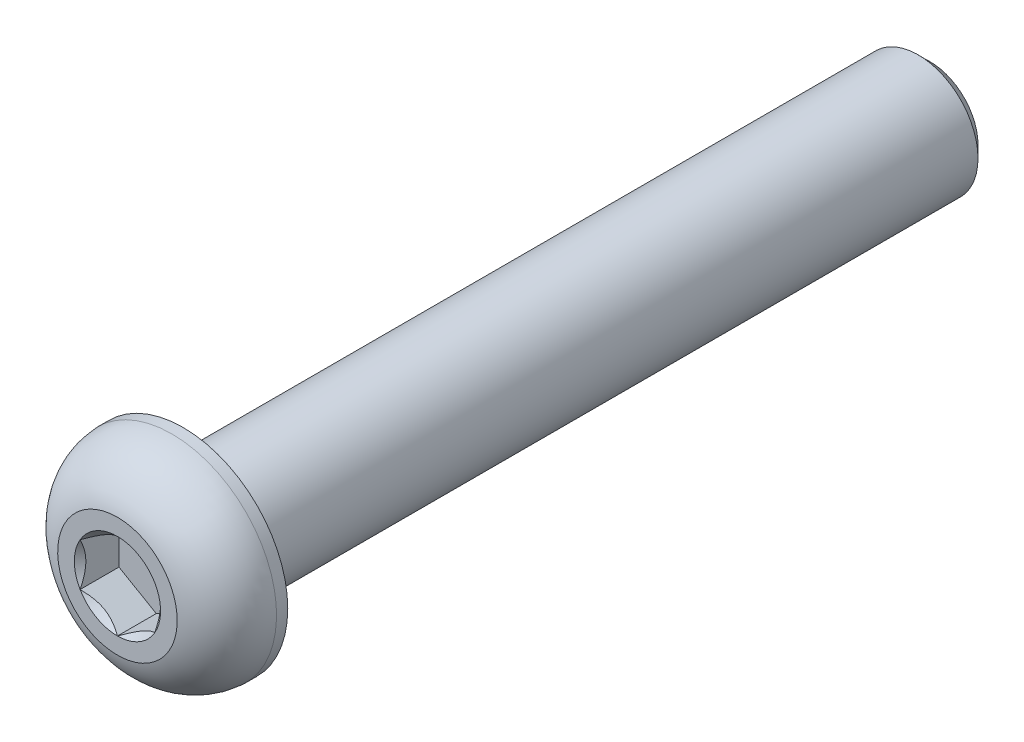
ISO-10303-21;
HEADER;
FILE_DESCRIPTION(('STEP AP214'),'2;1');
FILE_NAME('part.step','',(''),(''),'','','');
FILE_SCHEMA(('AUTOMOTIVE_DESIGN { 1 0 10303 214 1 1 1 1 }'));
ENDSEC;
DATA;
#1=APPLICATION_CONTEXT('core data for automotive mechanical design processes');
#2=APPLICATION_PROTOCOL_DEFINITION('international standard','automotive_design',2000,#1);
#3=PRODUCT_CONTEXT('',#1,'mechanical');
#4=PRODUCT('Part','Part','',(#3));
#5=PRODUCT_RELATED_PRODUCT_CATEGORY('part','',(#4));
#6=PRODUCT_DEFINITION_FORMATION('','',#4);
#7=PRODUCT_DEFINITION_CONTEXT('part definition',#1,'design');
#8=PRODUCT_DEFINITION('design','',#6,#7);
#9=PRODUCT_DEFINITION_SHAPE('','',#8);
#10=(LENGTH_UNIT() NAMED_UNIT(*) SI_UNIT(.MILLI.,.METRE.));
#11=(NAMED_UNIT(*) PLANE_ANGLE_UNIT() SI_UNIT($,.RADIAN.));
#12=(NAMED_UNIT(*) SI_UNIT($,.STERADIAN.) SOLID_ANGLE_UNIT());
#13=UNCERTAINTY_MEASURE_WITH_UNIT(LENGTH_MEASURE(1.E-05),#10,'distance_accuracy_value','');
#14=(GEOMETRIC_REPRESENTATION_CONTEXT(3) GLOBAL_UNCERTAINTY_ASSIGNED_CONTEXT((#13)) GLOBAL_UNIT_ASSIGNED_CONTEXT((#10,
#11,#12)) REPRESENTATION_CONTEXT('',''));
#15=CARTESIAN_POINT('',(0.,0.,0.));
#16=DIRECTION('',(0.,0.,1.));
#17=DIRECTION('',(1.,0.,0.));
#18=AXIS2_PLACEMENT_3D('',#15,#16,#17);
#19=CARTESIAN_POINT('',(-20.,0.,-71.2));
#20=DIRECTION('',(0.,0.,1.));
#21=DIRECTION('',(1.,0.,0.));
#22=AXIS2_PLACEMENT_3D('',#19,#20,#21);
#23=CYLINDRICAL_SURFACE('',#22,4.);
#24=CARTESIAN_POINT('',(-20.,0.,-70.4));
#25=DIRECTION('',(0.,0.,1.));
#26=DIRECTION('',(1.,0.,0.));
#27=AXIS2_PLACEMENT_3D('',#24,#25,#26);
#28=CIRCLE('',#27,4.);
#29=CARTESIAN_POINT('',(-16.,0.,-70.4));
#30=VERTEX_POINT('',#29);
#31=EDGE_CURVE('E50',#30,#30,#28,.T.);
#32=ORIENTED_EDGE('',*,*,#31,.T.);
#33=EDGE_LOOP('',(#32));
#34=FACE_BOUND('',#33,.T.);
#35=CARTESIAN_POINT('',(-20.,0.,-21.2));
#36=DIRECTION('',(0.,0.,1.));
#37=DIRECTION('',(1.,0.,0.));
#38=AXIS2_PLACEMENT_3D('',#35,#36,#37);
#39=CIRCLE('',#38,4.);
#40=CARTESIAN_POINT('',(-16.,0.,-21.2));
#41=VERTEX_POINT('',#40);
#42=EDGE_CURVE('E115',#41,#41,#39,.T.);
#43=ORIENTED_EDGE('',*,*,#42,.F.);
#44=EDGE_LOOP('',(#43));
#45=FACE_BOUND('',#44,.T.);
#46=ADVANCED_FACE('F41',(#34,#45),#23,.T.);
#47=CARTESIAN_POINT('',(-20.,0.,-71.2));
#48=DIRECTION('',(0.,0.,1.));
#49=DIRECTION('',(1.,0.,0.));
#50=AXIS2_PLACEMENT_3D('',#47,#48,#49);
#51=PLANE('',#50);
#52=CARTESIAN_POINT('',(-20.,0.,-71.2));
#53=DIRECTION('',(0.,0.,1.));
#54=DIRECTION('',(1.,0.,0.));
#55=AXIS2_PLACEMENT_3D('',#52,#53,#54);
#56=CIRCLE('',#55,3.19999999999999);
#57=CARTESIAN_POINT('',(-16.8,0.,-71.2));
#58=VERTEX_POINT('',#57);
#59=EDGE_CURVE('E11',#58,#58,#56,.F.);
#60=ORIENTED_EDGE('',*,*,#59,.T.);
#61=EDGE_LOOP('',(#60));
#62=FACE_BOUND('',#61,.T.);
#63=ADVANCED_FACE('F208',(#62),#51,.F.);
#64=CARTESIAN_POINT('',(-20.,0.,-16.8));
#65=DIRECTION('',(0.,0.,-1.));
#66=DIRECTION('',(-1.,0.,0.));
#67=AXIS2_PLACEMENT_3D('',#64,#65,#66);
#68=CYLINDRICAL_SURFACE('',#67,7.);
#69=CARTESIAN_POINT('',(-20.,0.,-21.2));
#70=DIRECTION('',(0.,0.,1.));
#71=DIRECTION('',(1.,0.,0.));
#72=AXIS2_PLACEMENT_3D('',#69,#70,#71);
#73=CIRCLE('',#72,7.);
#74=CARTESIAN_POINT('',(-13.,0.,-21.2));
#75=VERTEX_POINT('',#74);
#76=EDGE_CURVE('E270',#75,#75,#73,.T.);
#77=ORIENTED_EDGE('',*,*,#76,.T.);
#78=EDGE_LOOP('',(#77));
#79=FACE_BOUND('',#78,.T.);
#80=CARTESIAN_POINT('',(-20.,0.,-20.4492371013581));
#81=DIRECTION('',(0.,0.,-1.));
#82=DIRECTION('',(0.,1.,0.));
#83=AXIS2_PLACEMENT_3D('',#80,#81,#82);
#84=CIRCLE('',#83,7.);
#85=CARTESIAN_POINT('',(-20.,6.99999999999999,-20.4492371013581));
#86=VERTEX_POINT('',#85);
#87=EDGE_CURVE('E267',#86,#86,#84,.T.);
#88=ORIENTED_EDGE('',*,*,#87,.T.);
#89=EDGE_LOOP('',(#88));
#90=FACE_BOUND('',#89,.T.);
#91=ADVANCED_FACE('F214',(#79,#90),#68,.T.);
#92=CARTESIAN_POINT('',(-20.,0.,-21.2));
#93=DIRECTION('',(0.,0.,1.));
#94=DIRECTION('',(1.,0.,0.));
#95=AXIS2_PLACEMENT_3D('',#92,#93,#94);
#96=PLANE('',#95);
#97=ORIENTED_EDGE('',*,*,#42,.T.);
#98=EDGE_LOOP('',(#97));
#99=FACE_BOUND('',#98,.T.);
#100=ORIENTED_EDGE('',*,*,#76,.F.);
#101=EDGE_LOOP('',(#100));
#102=FACE_BOUND('',#101,.T.);
#103=ADVANCED_FACE('F222',(#99,#102),#96,.F.);
#104=CARTESIAN_POINT('',(-20.,0.,-20.6746185506791));
#105=DIRECTION('',(0.,0.,-1.));
#106=DIRECTION('',(0.,1.,0.));
#107=AXIS2_PLACEMENT_3D('',#104,#105,#106);
#108=DEGENERATE_TOROIDAL_SURFACE('',#107,3.00635464740521,4.,.T.);
#109=CARTESIAN_POINT('',(-20.,0.,-16.8));
#110=DIRECTION('',(0.,0.,-1.));
#111=DIRECTION('',(0.,1.,0.));
#112=AXIS2_PLACEMENT_3D('',#109,#110,#111);
#113=CIRCLE('',#112,4.);
#114=CARTESIAN_POINT('',(-20.,3.99999999999999,-16.8));
#115=VERTEX_POINT('',#114);
#116=EDGE_CURVE('E256',#115,#115,#113,.T.);
#117=ORIENTED_EDGE('',*,*,#116,.T.);
#118=EDGE_LOOP('',(#117));
#119=FACE_BOUND('',#118,.T.);
#120=ORIENTED_EDGE('',*,*,#87,.F.);
#121=EDGE_LOOP('',(#120));
#122=FACE_BOUND('',#121,.T.);
#123=ADVANCED_FACE('F226',(#119,#122),#108,.T.);
#124=CARTESIAN_POINT('',(-20.,0.,-16.8));
#125=DIRECTION('',(0.,0.,1.));
#126=DIRECTION('',(1.,0.,0.));
#127=AXIS2_PLACEMENT_3D('',#124,#125,#126);
#128=PLANE('',#127);
#129=CARTESIAN_POINT('',(-20.,0.,-16.8));
#130=DIRECTION('',(0.,0.,1.));
#131=DIRECTION('',(1.,0.,0.));
#132=AXIS2_PLACEMENT_3D('',#129,#130,#131);
#133=CIRCLE('',#132,2.88675134594814);
#134=CARTESIAN_POINT('',(-17.5,1.44337567297408,-16.8));
#135=VERTEX_POINT('',#134);
#136=CARTESIAN_POINT('',(-20.,2.88675134594814,-16.8));
#137=VERTEX_POINT('',#136);
#138=EDGE_CURVE('E96',#135,#137,#133,.T.);
#139=ORIENTED_EDGE('',*,*,#138,.F.);
#140=CARTESIAN_POINT('',(-17.5,-1.44337567297407,-16.8));
#141=VERTEX_POINT('',#140);
#142=EDGE_CURVE('E56',#141,#135,#133,.T.);
#143=ORIENTED_EDGE('',*,*,#142,.F.);
#144=CARTESIAN_POINT('',(-20.,-2.88675134594814,-16.8));
#145=VERTEX_POINT('',#144);
#146=EDGE_CURVE('E288',#145,#141,#133,.T.);
#147=ORIENTED_EDGE('',*,*,#146,.F.);
#148=CARTESIAN_POINT('',(-22.5,-1.44337567297408,-16.8));
#149=VERTEX_POINT('',#148);
#150=EDGE_CURVE('E63',#149,#145,#133,.T.);
#151=ORIENTED_EDGE('',*,*,#150,.F.);
#152=CARTESIAN_POINT('',(-22.5,1.44337567297406,-16.8));
#153=VERTEX_POINT('',#152);
#154=EDGE_CURVE('E137',#153,#149,#133,.T.);
#155=ORIENTED_EDGE('',*,*,#154,.F.);
#156=EDGE_CURVE('E105',#137,#153,#133,.T.);
#157=ORIENTED_EDGE('',*,*,#156,.F.);
#158=EDGE_LOOP('',(#139,#143,#147,#151,#155,#157));
#159=FACE_BOUND('',#158,.T.);
#160=ORIENTED_EDGE('',*,*,#116,.F.);
#161=EDGE_LOOP('',(#160));
#162=FACE_BOUND('',#161,.T.);
#163=ADVANCED_FACE('F135',(#159,#162),#128,.T.);
#164=CARTESIAN_POINT('',(-20.,0.,-16.8));
#165=DIRECTION('',(0.,0.,1.));
#166=DIRECTION('',(1.,0.,0.));
#167=AXIS2_PLACEMENT_3D('',#164,#165,#166);
#168=CONICAL_SURFACE('',#167,2.88675134594814,0.78539816339745);
#169=ORIENTED_EDGE('',*,*,#156,.T.);
#170=CARTESIAN_POINT('',(-19.9998,2.88686681600196,-16.7998845230182));
#171=CARTESIAN_POINT('',(-20.0857382777878,2.8372503281875,-16.8494592946453));
#172=CARTESIAN_POINT('',(-20.1731135672758,2.78680418128109,-16.8961225186375));
#173=CARTESIAN_POINT('',(-20.3512814561656,2.6839389026696,-16.9815618599617));
#174=CARTESIAN_POINT('',(-20.4420910006811,2.6315099876986,-17.020290437594));
#175=CARTESIAN_POINT('',(-20.6252041231269,2.52578957716234,-17.0866332961023));
#176=CARTESIAN_POINT('',(-20.7174610645293,2.47252500720904,-17.1144143314691));
#177=CARTESIAN_POINT('',(-20.9040060087763,2.3648232334321,-17.1572168240893));
#178=CARTESIAN_POINT('',(-20.9982883125663,2.31038931995913,-17.1722702333287));
#179=CARTESIAN_POINT('',(-21.1607782582918,2.21657570605387,-17.1858522777905));
#180=CARTESIAN_POINT('',(-21.2287759678801,2.17731721011878,-17.1878629007592));
#181=CARTESIAN_POINT('',(-21.3646602411692,2.0988643883567,-17.1844758828125));
#182=CARTESIAN_POINT('',(-21.4325467575522,2.05967008984862,-17.1790756447002));
#183=CARTESIAN_POINT('',(-21.5676787882361,1.98165157555715,-17.1611742115975));
#184=CARTESIAN_POINT('',(-21.6349234997536,1.94282782326097,-17.1486650729535));
#185=CARTESIAN_POINT('',(-21.7682501008182,1.86585167424616,-17.1172324980443));
#186=CARTESIAN_POINT('',(-21.8343320790997,1.82769922629678,-17.0983095535032));
#187=CARTESIAN_POINT('',(-22.0035963466913,1.72997445583858,-17.0421326385918));
#188=CARTESIAN_POINT('',(-22.1057291222229,1.67100807039231,-17.0006441684038));
#189=CARTESIAN_POINT('',(-22.2559064149405,1.58430317001562,-16.9306059532769));
#190=CARTESIAN_POINT('',(-22.3053965398826,1.55573003305807,-16.9059977478839));
#191=CARTESIAN_POINT('',(-22.4034600638388,1.49911303110426,-16.8545381132848));
#192=CARTESIAN_POINT('',(-22.4520340034969,1.47106885396706,-16.8276880612207));
#193=CARTESIAN_POINT('',(-22.5002,1.44326020292023,-16.7998845230182));
#194=B_SPLINE_CURVE_WITH_KNOTS('',3,(#170,#171,#172,#173,#174,#175,#176,#177,#178,#179,#180,
#181,#182,#183,#184,#185,#186,#187,#188,#189,#190,#191,#192,#193),.UNSPECIFIED.,.F.,.F.,(4,2,2,
2,2,2,2,2,2,2,2,4),(0.,0.333012085133922,0.667964518301391,0.997597032043288,1.32639954393843,
1.56169424147168,1.79707142102082,2.0327121352217,2.26833478775649,2.64260240809532,
2.82922877818863,3.01574133749024),.UNSPECIFIED.);
#195=EDGE_CURVE('E110',#137,#153,#194,.T.);
#196=ORIENTED_EDGE('',*,*,#195,.F.);
#197=EDGE_LOOP('',(#169,#196));
#198=FACE_BOUND('',#197,.T.);
#199=ADVANCED_FACE('F111',(#198),#168,.F.);
#200=ORIENTED_EDGE('',*,*,#154,.T.);
#201=CARTESIAN_POINT('',(-22.5,4.49862613627795,-14.5401372051753));
#202=CARTESIAN_POINT('',(-22.5,4.36631721471857,-14.6557441977496));
#203=CARTESIAN_POINT('',(-22.5,4.2334468206294,-14.7707212796145));
#204=CARTESIAN_POINT('',(-22.5,3.96614359075441,-14.998965357782));
#205=CARTESIAN_POINT('',(-22.5,3.83171007828055,-15.1122315606403));
#206=CARTESIAN_POINT('',(-22.5,3.55815834420279,-15.3388189124461));
#207=CARTESIAN_POINT('',(-22.5,3.41900074596122,-15.4520926999651));
#208=CARTESIAN_POINT('',(-22.5,3.13816540864501,-15.6754153293813));
#209=CARTESIAN_POINT('',(-22.5,2.99648829813198,-15.7854649579876));
#210=CARTESIAN_POINT('',(-22.5,2.70961149424399,-16.0012350616157));
#211=CARTESIAN_POINT('',(-22.5,2.56440811475055,-16.1069506660195));
#212=CARTESIAN_POINT('',(-22.5,2.26935886391242,-16.3120352810879));
#213=CARTESIAN_POINT('',(-22.5,2.1195094173423,-16.4113992145075));
#214=CARTESIAN_POINT('',(-22.5,1.81473474990813,-16.5998493815048));
#215=CARTESIAN_POINT('',(-22.5,1.65984817680388,-16.6889973545657));
#216=CARTESIAN_POINT('',(-22.5,1.34241016747155,-16.8523912225315));
#217=CARTESIAN_POINT('',(-22.5,1.17987279751072,-16.9266632400684));
#218=CARTESIAN_POINT('',(-22.5,0.927579236460874,-17.0213841826896));
#219=CARTESIAN_POINT('',(-22.5,0.841058688340694,-17.0504014253439));
#220=CARTESIAN_POINT('',(-22.5,0.665833262959965,-17.1009634522494));
#221=CARTESIAN_POINT('',(-22.5,0.577128732612051,-17.1225094151718));
#222=CARTESIAN_POINT('',(-22.5,0.39864435461647,-17.1566697169734));
#223=CARTESIAN_POINT('',(-22.5,0.308876821359169,-17.1693471500471));
#224=CARTESIAN_POINT('',(-22.5,0.128495601940259,-17.1850625327669));
#225=CARTESIAN_POINT('',(-22.5,0.0378820484480431,-17.1881019691611));
#226=CARTESIAN_POINT('',(-22.5,-0.143434587916144,-17.1842867231653));
#227=CARTESIAN_POINT('',(-22.5,-0.234136958906022,-17.1773989593265));
#228=CARTESIAN_POINT('',(-22.5,-0.414325653644167,-17.1542287088775));
#229=CARTESIAN_POINT('',(-22.5,-0.503811705770317,-17.137944157992));
#230=CARTESIAN_POINT('',(-22.5,-0.681540531837641,-17.0969731933558));
#231=CARTESIAN_POINT('',(-22.5,-0.769768082838922,-17.0722219859227));
#232=CARTESIAN_POINT('',(-22.5,-0.943931821370619,-17.0157563839652));
#233=CARTESIAN_POINT('',(-22.5,-1.02986790429993,-16.9840416721783));
#234=CARTESIAN_POINT('',(-22.5,-1.21442871168212,-16.908888337474));
#235=CARTESIAN_POINT('',(-22.5,-1.31260872704221,-16.8643682202414));
#236=CARTESIAN_POINT('',(-22.5,-1.50606624427993,-16.7693671776859));
#237=CARTESIAN_POINT('',(-22.5,-1.60134208055272,-16.7188829098143));
#238=CARTESIAN_POINT('',(-22.5,-1.78951407974901,-16.6132701412246));
#239=CARTESIAN_POINT('',(-22.5,-1.88240508306521,-16.5581325231622));
#240=CARTESIAN_POINT('',(-22.5,-2.06598114426054,-16.4443613162886));
#241=CARTESIAN_POINT('',(-22.5,-2.15666662219708,-16.3857284006394));
#242=CARTESIAN_POINT('',(-22.5,-2.33669825134608,-16.2653991342853));
#243=CARTESIAN_POINT('',(-22.5,-2.42603424932677,-16.2036876631612));
#244=CARTESIAN_POINT('',(-22.5,-2.60315746105273,-16.0780755199221));
#245=CARTESIAN_POINT('',(-22.5,-2.69094455711592,-16.0141746825398));
#246=CARTESIAN_POINT('',(-22.5,-2.95215706334526,-15.8200214272822));
#247=CARTESIAN_POINT('',(-22.5,-3.12364882600439,-15.6871712948484));
#248=CARTESIAN_POINT('',(-22.5,-3.49980821722714,-15.387554664258));
#249=CARTESIAN_POINT('',(-22.5,-3.70359202428011,-15.2196884747092));
#250=CARTESIAN_POINT('',(-22.5,-4.00519395775443,-14.9656562548721));
#251=CARTESIAN_POINT('',(-22.5,-4.10442571709459,-14.881155245238));
#252=CARTESIAN_POINT('',(-22.5,-4.30208719506624,-14.711270852601));
#253=CARTESIAN_POINT('',(-22.5,-4.40051711297303,-14.6258877015855));
#254=CARTESIAN_POINT('',(-22.5,-4.49862613627795,-14.5401372051753));
#255=B_SPLINE_CURVE_WITH_KNOTS('',3,(#201,#202,#203,#204,#205,#206,#207,#208,#209,#210,#211,
#212,#213,#214,#215,#216,#217,#218,#219,#220,#221,#222,#223,#224,#225,#226,#227,#228,#229,#230,
#231,#232,#233,#234,#235,#236,#237,#238,#239,#240,#241,#242,#243,#244,#245,#246,#247,#248,#249,
#250,#251,#252,#253,#254),.UNSPECIFIED.,.F.,.F.,(4,2,2,2,2,2,2,2,2,2,2,2,2,2,2,2,2,2,2,2,2,2,2,
2,2,2,4),(0.,0.527111663405214,1.05446070809944,1.59272193747455,2.13085071597393,
2.66956853854308,3.20871173802189,3.74440249620264,4.27914415459521,4.55264840930147,
4.82610949624842,5.09760472594187,5.36905807300277,5.64141810669612,5.91383799491442,
6.18839111423807,6.4629567450015,6.78609426817658,7.10941375743029,7.4333821286659,
7.75728830689595,8.08298202171529,8.40870037636492,9.05935611118931,9.8513240612482,
10.242327211952,10.6332300284246),.UNSPECIFIED.);
#256=EDGE_CURVE('E104',#153,#149,#255,.T.);
#257=ORIENTED_EDGE('',*,*,#256,.F.);
#258=EDGE_LOOP('',(#200,#257));
#259=FACE_BOUND('',#258,.T.);
#260=ADVANCED_FACE('F296',(#259),#168,.F.);
#261=ORIENTED_EDGE('',*,*,#150,.T.);
#262=CARTESIAN_POINT('',(-22.5002,-1.44326020292022,-16.7998845230182));
#263=CARTESIAN_POINT('',(-22.4142617222122,-1.49287669073468,-16.8494592946453));
#264=CARTESIAN_POINT('',(-22.3268864327242,-1.54332283764109,-16.8961225186375));
#265=CARTESIAN_POINT('',(-22.1487185438344,-1.64618811625259,-16.9815618599617));
#266=CARTESIAN_POINT('',(-22.0579089993189,-1.69861703122359,-17.020290437594));
#267=CARTESIAN_POINT('',(-21.8747958768731,-1.80433744175985,-17.0866332961023));
#268=CARTESIAN_POINT('',(-21.7825389354707,-1.85760201171315,-17.1144143314692));
#269=CARTESIAN_POINT('',(-21.5959939912237,-1.96530378549009,-17.1572168240893));
#270=CARTESIAN_POINT('',(-21.5017116874337,-2.01973769896306,-17.1722702333287));
#271=CARTESIAN_POINT('',(-21.3392217417082,-2.11355131286832,-17.1858522777905));
#272=CARTESIAN_POINT('',(-21.2712240321198,-2.15280980880341,-17.1878629007592));
#273=CARTESIAN_POINT('',(-21.1353397588308,-2.23126263056549,-17.1844758828125));
#274=CARTESIAN_POINT('',(-21.0674532424478,-2.27045692907357,-17.1790756447002));
#275=CARTESIAN_POINT('',(-20.9323212117639,-2.34847544336504,-17.1611742115975));
#276=CARTESIAN_POINT('',(-20.8650765002464,-2.38729919566122,-17.1486650729535));
#277=CARTESIAN_POINT('',(-20.7317498991818,-2.46427534467603,-17.1172324980443));
#278=CARTESIAN_POINT('',(-20.6656679209003,-2.50242779262541,-17.0983095535032));
#279=CARTESIAN_POINT('',(-20.4964036533087,-2.60015256308361,-17.0421326385918));
#280=CARTESIAN_POINT('',(-20.3942708777771,-2.65911894852988,-17.0006441684038));
#281=CARTESIAN_POINT('',(-20.2440935850595,-2.74582384890657,-16.9306059532769));
#282=CARTESIAN_POINT('',(-20.1946034601174,-2.77439698586412,-16.9059977478839));
#283=CARTESIAN_POINT('',(-20.0965399361612,-2.83101398781793,-16.8545381132848));
#284=CARTESIAN_POINT('',(-20.0479659965031,-2.85905816495513,-16.8276880612207));
#285=CARTESIAN_POINT('',(-19.9998,-2.88686681600196,-16.7998845230182));
#286=B_SPLINE_CURVE_WITH_KNOTS('',3,(#262,#263,#264,#265,#266,#267,#268,#269,#270,#271,#272,
#273,#274,#275,#276,#277,#278,#279,#280,#281,#282,#283,#284,#285),.UNSPECIFIED.,.F.,.F.,(4,2,2,
2,2,2,2,2,2,2,2,4),(0.,0.333012085133922,0.667964518301396,0.997597032043301,1.32639954393844,
1.56169424147169,1.79707142102083,2.03271213522171,2.26833478775651,2.64260240809533,
2.82922877818864,3.01574133749025),.UNSPECIFIED.);
#287=EDGE_CURVE('E147',#149,#145,#286,.T.);
#288=ORIENTED_EDGE('',*,*,#287,.F.);
#289=EDGE_LOOP('',(#261,#288));
#290=FACE_BOUND('',#289,.T.);
#291=ADVANCED_FACE('F291',(#290),#168,.F.);
#292=ORIENTED_EDGE('',*,*,#146,.T.);
#293=CARTESIAN_POINT('',(-20.0002,-2.88686681600196,-16.7998845230182));
#294=CARTESIAN_POINT('',(-19.9142617222122,-2.83725032818751,-16.8494592946453));
#295=CARTESIAN_POINT('',(-19.8268864327242,-2.7868041812811,-16.8961225186375));
#296=CARTESIAN_POINT('',(-19.6487185438344,-2.6839389026696,-16.9815618599617));
#297=CARTESIAN_POINT('',(-19.5579089993189,-2.6315099876986,-17.020290437594));
#298=CARTESIAN_POINT('',(-19.3747958768731,-2.52578957716234,-17.0866332961023));
#299=CARTESIAN_POINT('',(-19.2825389354707,-2.47252500720904,-17.1144143314691));
#300=CARTESIAN_POINT('',(-19.0959939912237,-2.36482323343211,-17.1572168240893));
#301=CARTESIAN_POINT('',(-19.0017116874337,-2.31038931995913,-17.1722702333287));
#302=CARTESIAN_POINT('',(-18.8392217417082,-2.21657570605387,-17.1858522777905));
#303=CARTESIAN_POINT('',(-18.7712240321199,-2.17731721011879,-17.1878629007592));
#304=CARTESIAN_POINT('',(-18.6353397588308,-2.09886438835671,-17.1844758828125));
#305=CARTESIAN_POINT('',(-18.5674532424478,-2.05967008984862,-17.1790756447002));
#306=CARTESIAN_POINT('',(-18.4323212117639,-1.98165157555715,-17.1611742115975));
#307=CARTESIAN_POINT('',(-18.3650765002464,-1.94282782326097,-17.1486650729535));
#308=CARTESIAN_POINT('',(-18.2317498991818,-1.86585167424616,-17.1172324980443));
#309=CARTESIAN_POINT('',(-18.1656679209003,-1.82769922629678,-17.0983095535032));
#310=CARTESIAN_POINT('',(-17.9964036533087,-1.72997445583858,-17.0421326385918));
#311=CARTESIAN_POINT('',(-17.8942708777771,-1.67100807039231,-17.0006441684038));
#312=CARTESIAN_POINT('',(-17.7440935850595,-1.58430317001563,-16.9306059532769));
#313=CARTESIAN_POINT('',(-17.6946034601174,-1.55573003305808,-16.9059977478839));
#314=CARTESIAN_POINT('',(-17.5965399361612,-1.49911303110426,-16.8545381132848));
#315=CARTESIAN_POINT('',(-17.5479659965031,-1.47106885396707,-16.8276880612207));
#316=CARTESIAN_POINT('',(-17.4998,-1.44326020292023,-16.7998845230182));
#317=B_SPLINE_CURVE_WITH_KNOTS('',3,(#293,#294,#295,#296,#297,#298,#299,#300,#301,#302,#303,
#304,#305,#306,#307,#308,#309,#310,#311,#312,#313,#314,#315,#316),.UNSPECIFIED.,.F.,.F.,(4,2,2,
2,2,2,2,2,2,2,2,4),(0.,0.333012085133917,0.667964518301387,0.997597032043288,1.32639954393843,
1.56169424147167,1.79707142102081,2.03271213522169,2.26833478775649,2.64260240809531,
2.82922877818862,3.01574133749023),.UNSPECIFIED.);
#318=EDGE_CURVE('E173',#145,#141,#317,.T.);
#319=ORIENTED_EDGE('',*,*,#318,.F.);
#320=EDGE_LOOP('',(#292,#319));
#321=FACE_BOUND('',#320,.T.);
#322=ADVANCED_FACE('F289',(#321),#168,.F.);
#323=ORIENTED_EDGE('',*,*,#142,.T.);
#324=CARTESIAN_POINT('',(-17.5,-4.49862613627796,-14.5401372051753));
#325=CARTESIAN_POINT('',(-17.5,-4.36631721471859,-14.6557441977496));
#326=CARTESIAN_POINT('',(-17.5,-4.23344682062941,-14.7707212796145));
#327=CARTESIAN_POINT('',(-17.5,-3.96614359075442,-14.998965357782));
#328=CARTESIAN_POINT('',(-17.5,-3.83171007828056,-15.1122315606403));
#329=CARTESIAN_POINT('',(-17.5,-3.5581583442028,-15.3388189124461));
#330=CARTESIAN_POINT('',(-17.5,-3.41900074596123,-15.4520926999651));
#331=CARTESIAN_POINT('',(-17.5,-3.13816540864502,-15.6754153293813));
#332=CARTESIAN_POINT('',(-17.5,-2.99648829813199,-15.7854649579876));
#333=CARTESIAN_POINT('',(-17.5,-2.709611494244,-16.0012350616157));
#334=CARTESIAN_POINT('',(-17.5,-2.56440811475056,-16.1069506660195));
#335=CARTESIAN_POINT('',(-17.5,-2.26935886391243,-16.3120352810879));
#336=CARTESIAN_POINT('',(-17.5,-2.1195094173423,-16.4113992145075));
#337=CARTESIAN_POINT('',(-17.5,-1.81473474990813,-16.5998493815048));
#338=CARTESIAN_POINT('',(-17.5,-1.65984817680388,-16.6889973545657));
#339=CARTESIAN_POINT('',(-17.5,-1.34241016747155,-16.8523912225315));
#340=CARTESIAN_POINT('',(-17.5,-1.17987279751072,-16.9266632400684));
#341=CARTESIAN_POINT('',(-17.5,-0.927579236460876,-17.0213841826896));
#342=CARTESIAN_POINT('',(-17.5,-0.841058688340696,-17.0504014253439));
#343=CARTESIAN_POINT('',(-17.5,-0.665833262959967,-17.1009634522494));
#344=CARTESIAN_POINT('',(-17.5,-0.577128732612053,-17.1225094151718));
#345=CARTESIAN_POINT('',(-17.5,-0.398644354616472,-17.1566697169734));
#346=CARTESIAN_POINT('',(-17.5,-0.30887682135917,-17.1693471500471));
#347=CARTESIAN_POINT('',(-17.5,-0.12849560194026,-17.1850625327669));
#348=CARTESIAN_POINT('',(-17.5,-0.0378820484480437,-17.1881019691611));
#349=CARTESIAN_POINT('',(-17.5,0.143434587916143,-17.1842867231653));
#350=CARTESIAN_POINT('',(-17.5,0.234136958906022,-17.1773989593265));
#351=CARTESIAN_POINT('',(-17.5,0.414325653644168,-17.1542287088775));
#352=CARTESIAN_POINT('',(-17.5,0.503811705770318,-17.137944157992));
#353=CARTESIAN_POINT('',(-17.5,0.681540531837642,-17.0969731933558));
#354=CARTESIAN_POINT('',(-17.5,0.769768082838922,-17.0722219859227));
#355=CARTESIAN_POINT('',(-17.5,0.943931821370619,-17.0157563839652));
#356=CARTESIAN_POINT('',(-17.5,1.02986790429993,-16.9840416721783));
#357=CARTESIAN_POINT('',(-17.5,1.21442871168212,-16.908888337474));
#358=CARTESIAN_POINT('',(-17.5,1.3126087270422,-16.8643682202414));
#359=CARTESIAN_POINT('',(-17.5,1.50606624427993,-16.7693671776859));
#360=CARTESIAN_POINT('',(-17.5,1.60134208055272,-16.7188829098143));
#361=CARTESIAN_POINT('',(-17.5,1.78951407974901,-16.6132701412246));
#362=CARTESIAN_POINT('',(-17.5,1.88240508306521,-16.5581325231622));
#363=CARTESIAN_POINT('',(-17.5,2.06598114426054,-16.4443613162886));
#364=CARTESIAN_POINT('',(-17.5,2.15666662219708,-16.3857284006394));
#365=CARTESIAN_POINT('',(-17.5,2.33669825134608,-16.2653991342853));
#366=CARTESIAN_POINT('',(-17.5,2.42603424932677,-16.2036876631612));
#367=CARTESIAN_POINT('',(-17.5,2.60315746105273,-16.0780755199221));
#368=CARTESIAN_POINT('',(-17.5,2.69094455711592,-16.0141746825398));
#369=CARTESIAN_POINT('',(-17.5,2.95215706334526,-15.8200214272822));
#370=CARTESIAN_POINT('',(-17.5,3.12364882600439,-15.6871712948484));
#371=CARTESIAN_POINT('',(-17.5,3.49980821722714,-15.387554664258));
#372=CARTESIAN_POINT('',(-17.5,3.70359202428011,-15.2196884747092));
#373=CARTESIAN_POINT('',(-17.5,4.00519395775443,-14.965656254872));
#374=CARTESIAN_POINT('',(-17.5,4.10442571709459,-14.881155245238));
#375=CARTESIAN_POINT('',(-17.5,4.30208719506624,-14.711270852601));
#376=CARTESIAN_POINT('',(-17.5,4.40051711297303,-14.6258877015855));
#377=CARTESIAN_POINT('',(-17.5,4.49862613627795,-14.5401372051753));
#378=B_SPLINE_CURVE_WITH_KNOTS('',3,(#324,#325,#326,#327,#328,#329,#330,#331,#332,#333,#334,
#335,#336,#337,#338,#339,#340,#341,#342,#343,#344,#345,#346,#347,#348,#349,#350,#351,#352,#353,
#354,#355,#356,#357,#358,#359,#360,#361,#362,#363,#364,#365,#366,#367,#368,#369,#370,#371,#372,
#373,#374,#375,#376,#377),.UNSPECIFIED.,.F.,.F.,(4,2,2,2,2,2,2,2,2,2,2,2,2,2,2,2,2,2,2,2,2,2,2,
2,2,2,4),(0.,0.527111663405215,1.05446070809945,1.59272193747456,2.13085071597394,
2.66956853854309,3.2087117380219,3.74440249620266,4.27914415459523,4.55264840930149,
4.82610949624844,5.09760472594189,5.36905807300278,5.64141810669614,5.91383799491444,
6.18839111423808,6.46295674500151,6.78609426817659,7.10941375743031,7.43338212866591,
7.75728830689596,8.08298202171531,8.40870037636493,9.05935611118932,9.85132406124822,
10.242327211952,10.6332300284246),.UNSPECIFIED.);
#379=EDGE_CURVE('E125',#141,#135,#378,.T.);
#380=ORIENTED_EDGE('',*,*,#379,.F.);
#381=EDGE_LOOP('',(#323,#380));
#382=FACE_BOUND('',#381,.T.);
#383=ADVANCED_FACE('F161',(#382),#168,.F.);
#384=ORIENTED_EDGE('',*,*,#138,.T.);
#385=CARTESIAN_POINT('',(-17.4998,1.44326020292022,-16.7998845230182));
#386=CARTESIAN_POINT('',(-17.5857382777878,1.49287669073468,-16.8494592946453));
#387=CARTESIAN_POINT('',(-17.6731135672758,1.5433228376411,-16.8961225186375));
#388=CARTESIAN_POINT('',(-17.8512814561656,1.64618811625259,-16.9815618599617));
#389=CARTESIAN_POINT('',(-17.9420910006811,1.69861703122359,-17.020290437594));
#390=CARTESIAN_POINT('',(-18.1252041231269,1.80433744175986,-17.0866332961023));
#391=CARTESIAN_POINT('',(-18.2174610645294,1.85760201171316,-17.1144143314692));
#392=CARTESIAN_POINT('',(-18.4040060087763,1.96530378549009,-17.1572168240893));
#393=CARTESIAN_POINT('',(-18.4982883125663,2.01973769896307,-17.1722702333287));
#394=CARTESIAN_POINT('',(-18.6607782582919,2.11355131286833,-17.1858522777905));
#395=CARTESIAN_POINT('',(-18.7287759678802,2.15280980880342,-17.1878629007592));
#396=CARTESIAN_POINT('',(-18.8646602411692,2.2312626305655,-17.1844758828125));
#397=CARTESIAN_POINT('',(-18.9325467575523,2.27045692907358,-17.1790756447002));
#398=CARTESIAN_POINT('',(-19.0676787882361,2.34847544336505,-17.1611742115975));
#399=CARTESIAN_POINT('',(-19.1349234997536,2.38729919566123,-17.1486650729535));
#400=CARTESIAN_POINT('',(-19.2682501008182,2.46427534467604,-17.1172324980443));
#401=CARTESIAN_POINT('',(-19.3343320790997,2.50242779262542,-17.0983095535032));
#402=CARTESIAN_POINT('',(-19.5035963466913,2.60015256308362,-17.0421326385918));
#403=CARTESIAN_POINT('',(-19.6057291222229,2.65911894852989,-17.0006441684038));
#404=CARTESIAN_POINT('',(-19.7559064149405,2.74582384890657,-16.9306059532769));
#405=CARTESIAN_POINT('',(-19.8053965398826,2.77439698586412,-16.9059977478839));
#406=CARTESIAN_POINT('',(-19.9034600638388,2.83101398781793,-16.8545381132848));
#407=CARTESIAN_POINT('',(-19.9520340034969,2.85905816495513,-16.8276880612207));
#408=CARTESIAN_POINT('',(-20.0002,2.88686681600196,-16.7998845230182));
#409=B_SPLINE_CURVE_WITH_KNOTS('',3,(#385,#386,#387,#388,#389,#390,#391,#392,#393,#394,#395,
#396,#397,#398,#399,#400,#401,#402,#403,#404,#405,#406,#407,#408),.UNSPECIFIED.,.F.,.F.,(4,2,2,
2,2,2,2,2,2,2,2,4),(0.,0.333012085133927,0.667964518301404,0.997597032043309,1.32639954393845,
1.5616942414717,1.79707142102084,2.03271213522172,2.26833478775652,2.64260240809533,
2.82922877818864,3.01574133749024),.UNSPECIFIED.);
#410=EDGE_CURVE('E100',#135,#137,#409,.T.);
#411=ORIENTED_EDGE('',*,*,#410,.F.);
#412=EDGE_LOOP('',(#384,#411));
#413=FACE_BOUND('',#412,.T.);
#414=ADVANCED_FACE('F98',(#413),#168,.F.);
#415=CARTESIAN_POINT('',(0.,0.,-19.4));
#416=DIRECTION('',(0.,0.,1.));
#417=DIRECTION('',(1.,0.,0.));
#418=AXIS2_PLACEMENT_3D('',#415,#416,#417);
#419=PLANE('',#418);
#420=DIRECTION('',(-0.866025403784439,0.5,0.));
#421=VECTOR('',#420,1.);
#422=CARTESIAN_POINT('',(-17.5,1.44337567297406,-19.4));
#423=LINE('',#422,#421);
#424=CARTESIAN_POINT('',(-17.5,1.44337567297406,-19.4));
#425=VERTEX_POINT('',#424);
#426=CARTESIAN_POINT('',(-20.,2.88675134594813,-19.4));
#427=VERTEX_POINT('',#426);
#428=EDGE_CURVE('E124',#425,#427,#423,.T.);
#429=ORIENTED_EDGE('',*,*,#428,.T.);
#430=DIRECTION('',(-0.866025403784439,-0.5,0.));
#431=VECTOR('',#430,1.);
#432=CARTESIAN_POINT('',(-20.,2.88675134594813,-19.4));
#433=LINE('',#432,#431);
#434=CARTESIAN_POINT('',(-22.5,1.44337567297406,-19.4));
#435=VERTEX_POINT('',#434);
#436=EDGE_CURVE('E129',#427,#435,#433,.T.);
#437=ORIENTED_EDGE('',*,*,#436,.T.);
#438=DIRECTION('',(0.,-1.,0.));
#439=VECTOR('',#438,1.);
#440=CARTESIAN_POINT('',(-22.5,1.44337567297406,-19.4));
#441=LINE('',#440,#439);
#442=CARTESIAN_POINT('',(-22.5,-1.44337567297406,-19.4));
#443=VERTEX_POINT('',#442);
#444=EDGE_CURVE('E245',#435,#443,#441,.T.);
#445=ORIENTED_EDGE('',*,*,#444,.T.);
#446=DIRECTION('',(0.866025403784439,-0.5,0.));
#447=VECTOR('',#446,1.);
#448=CARTESIAN_POINT('',(-22.5,-1.44337567297406,-19.4));
#449=LINE('',#448,#447);
#450=CARTESIAN_POINT('',(-20.,-2.88675134594813,-19.4));
#451=VERTEX_POINT('',#450);
#452=EDGE_CURVE('E249',#443,#451,#449,.T.);
#453=ORIENTED_EDGE('',*,*,#452,.T.);
#454=DIRECTION('',(0.866025403784439,0.5,0.));
#455=VECTOR('',#454,1.);
#456=CARTESIAN_POINT('',(-20.,-2.88675134594813,-19.4));
#457=LINE('',#456,#455);
#458=CARTESIAN_POINT('',(-17.5,-1.44337567297407,-19.4));
#459=VERTEX_POINT('',#458);
#460=EDGE_CURVE('E252',#451,#459,#457,.T.);
#461=ORIENTED_EDGE('',*,*,#460,.T.);
#462=DIRECTION('',(0.,1.,0.));
#463=VECTOR('',#462,1.);
#464=CARTESIAN_POINT('',(-17.5,-1.44337567297407,-19.4));
#465=LINE('',#464,#463);
#466=EDGE_CURVE('E132',#459,#425,#465,.T.);
#467=ORIENTED_EDGE('',*,*,#466,.T.);
#468=EDGE_LOOP('',(#429,#437,#445,#453,#461,#467));
#469=FACE_BOUND('',#468,.T.);
#470=ADVANCED_FACE('F160',(#469),#419,.T.);
#471=CARTESIAN_POINT('',(-20.,2.88675134594813,-19.4));
#472=DIRECTION('',(-0.5,0.866025403784439,0.));
#473=DIRECTION('',(-0.866025403784439,-0.5,0.));
#474=AXIS2_PLACEMENT_3D('',#471,#472,#473);
#475=PLANE('',#474);
#476=DIRECTION('',(0.,0.,1.));
#477=VECTOR('',#476,1.);
#478=CARTESIAN_POINT('',(-20.,2.88675134594813,-19.4));
#479=LINE('',#478,#477);
#480=EDGE_CURVE('E121',#427,#137,#479,.T.);
#481=ORIENTED_EDGE('',*,*,#480,.T.);
#482=ORIENTED_EDGE('',*,*,#195,.T.);
#483=DIRECTION('',(0.,0.,1.));
#484=VECTOR('',#483,1.);
#485=CARTESIAN_POINT('',(-22.5,1.44337567297406,-19.4));
#486=LINE('',#485,#484);
#487=EDGE_CURVE('E131',#435,#153,#486,.T.);
#488=ORIENTED_EDGE('',*,*,#487,.F.);
#489=ORIENTED_EDGE('',*,*,#436,.F.);
#490=EDGE_LOOP('',(#481,#482,#488,#489));
#491=FACE_BOUND('',#490,.T.);
#492=ADVANCED_FACE('F127',(#491),#475,.F.);
#493=CARTESIAN_POINT('',(-22.5,1.44337567297406,-19.4));
#494=DIRECTION('',(-1.,0.,0.));
#495=DIRECTION('',(0.,0.,1.));
#496=AXIS2_PLACEMENT_3D('',#493,#494,#495);
#497=PLANE('',#496);
#498=ORIENTED_EDGE('',*,*,#487,.T.);
#499=ORIENTED_EDGE('',*,*,#256,.T.);
#500=DIRECTION('',(0.,0.,1.));
#501=VECTOR('',#500,1.);
#502=CARTESIAN_POINT('',(-22.5,-1.44337567297406,-19.4));
#503=LINE('',#502,#501);
#504=EDGE_CURVE('E262',#443,#149,#503,.T.);
#505=ORIENTED_EDGE('',*,*,#504,.F.);
#506=ORIENTED_EDGE('',*,*,#444,.F.);
#507=EDGE_LOOP('',(#498,#499,#505,#506));
#508=FACE_BOUND('',#507,.T.);
#509=ADVANCED_FACE('F154',(#508),#497,.F.);
#510=CARTESIAN_POINT('',(-22.5,-1.44337567297406,-19.4));
#511=DIRECTION('',(-0.5,-0.866025403784439,0.));
#512=DIRECTION('',(0.866025403784439,-0.5,0.));
#513=AXIS2_PLACEMENT_3D('',#510,#511,#512);
#514=PLANE('',#513);
#515=ORIENTED_EDGE('',*,*,#504,.T.);
#516=ORIENTED_EDGE('',*,*,#287,.T.);
#517=DIRECTION('',(0.,0.,1.));
#518=VECTOR('',#517,1.);
#519=CARTESIAN_POINT('',(-20.,-2.88675134594813,-19.4));
#520=LINE('',#519,#518);
#521=EDGE_CURVE('E259',#451,#145,#520,.T.);
#522=ORIENTED_EDGE('',*,*,#521,.F.);
#523=ORIENTED_EDGE('',*,*,#452,.F.);
#524=EDGE_LOOP('',(#515,#516,#522,#523));
#525=FACE_BOUND('',#524,.T.);
#526=ADVANCED_FACE('F197',(#525),#514,.F.);
#527=CARTESIAN_POINT('',(-20.,-2.88675134594813,-19.4));
#528=DIRECTION('',(0.5,-0.866025403784439,0.));
#529=DIRECTION('',(0.866025403784439,0.5,0.));
#530=AXIS2_PLACEMENT_3D('',#527,#528,#529);
#531=PLANE('',#530);
#532=ORIENTED_EDGE('',*,*,#521,.T.);
#533=ORIENTED_EDGE('',*,*,#318,.T.);
#534=DIRECTION('',(0.,0.,1.));
#535=VECTOR('',#534,1.);
#536=CARTESIAN_POINT('',(-17.5,-1.44337567297407,-19.4));
#537=LINE('',#536,#535);
#538=EDGE_CURVE('E257',#459,#141,#537,.T.);
#539=ORIENTED_EDGE('',*,*,#538,.F.);
#540=ORIENTED_EDGE('',*,*,#460,.F.);
#541=EDGE_LOOP('',(#532,#533,#539,#540));
#542=FACE_BOUND('',#541,.T.);
#543=ADVANCED_FACE('F193',(#542),#531,.F.);
#544=CARTESIAN_POINT('',(-17.5,-1.44337567297407,-19.4));
#545=DIRECTION('',(1.,0.,0.));
#546=DIRECTION('',(0.,0.,-1.));
#547=AXIS2_PLACEMENT_3D('',#544,#545,#546);
#548=PLANE('',#547);
#549=ORIENTED_EDGE('',*,*,#538,.T.);
#550=ORIENTED_EDGE('',*,*,#379,.T.);
#551=DIRECTION('',(0.,0.,1.));
#552=VECTOR('',#551,1.);
#553=CARTESIAN_POINT('',(-17.5,1.44337567297406,-19.4));
#554=LINE('',#553,#552);
#555=EDGE_CURVE('E123',#425,#135,#554,.T.);
#556=ORIENTED_EDGE('',*,*,#555,.F.);
#557=ORIENTED_EDGE('',*,*,#466,.F.);
#558=EDGE_LOOP('',(#549,#550,#556,#557));
#559=FACE_BOUND('',#558,.T.);
#560=ADVANCED_FACE('F190',(#559),#548,.F.);
#561=CARTESIAN_POINT('',(-17.5,1.44337567297406,-19.4));
#562=DIRECTION('',(0.5,0.866025403784439,0.));
#563=DIRECTION('',(-0.866025403784439,0.5,0.));
#564=AXIS2_PLACEMENT_3D('',#561,#562,#563);
#565=PLANE('',#564);
#566=ORIENTED_EDGE('',*,*,#555,.T.);
#567=ORIENTED_EDGE('',*,*,#410,.T.);
#568=ORIENTED_EDGE('',*,*,#480,.F.);
#569=ORIENTED_EDGE('',*,*,#428,.F.);
#570=EDGE_LOOP('',(#566,#567,#568,#569));
#571=FACE_BOUND('',#570,.T.);
#572=ADVANCED_FACE('F119',(#571),#565,.F.);
#573=CARTESIAN_POINT('',(-20.,0.,-70.4));
#574=DIRECTION('',(0.,0.,1.));
#575=DIRECTION('',(1.,0.,0.));
#576=AXIS2_PLACEMENT_3D('',#573,#574,#575);
#577=CONICAL_SURFACE('',#576,4.,0.785398163397441);
#578=ORIENTED_EDGE('',*,*,#59,.F.);
#579=EDGE_LOOP('',(#578));
#580=FACE_BOUND('',#579,.T.);
#581=ORIENTED_EDGE('',*,*,#31,.F.);
#582=EDGE_LOOP('',(#581));
#583=FACE_BOUND('',#582,.T.);
#584=ADVANCED_FACE('F44',(#580,#583),#577,.T.);
#585=CLOSED_SHELL('',(#46,#63,#91,#103,#123,#163,#199,#260,#291,#322,#383,#414,#470,#492,#509,
#526,#543,#560,#572,#584));
#586=MANIFOLD_SOLID_BREP('B2',#585);
#587=ADVANCED_BREP_SHAPE_REPRESENTATION('',(#18,#586),#14);
#588=SHAPE_DEFINITION_REPRESENTATION(#9,#587);
ENDSEC;
END-ISO-10303-21;
